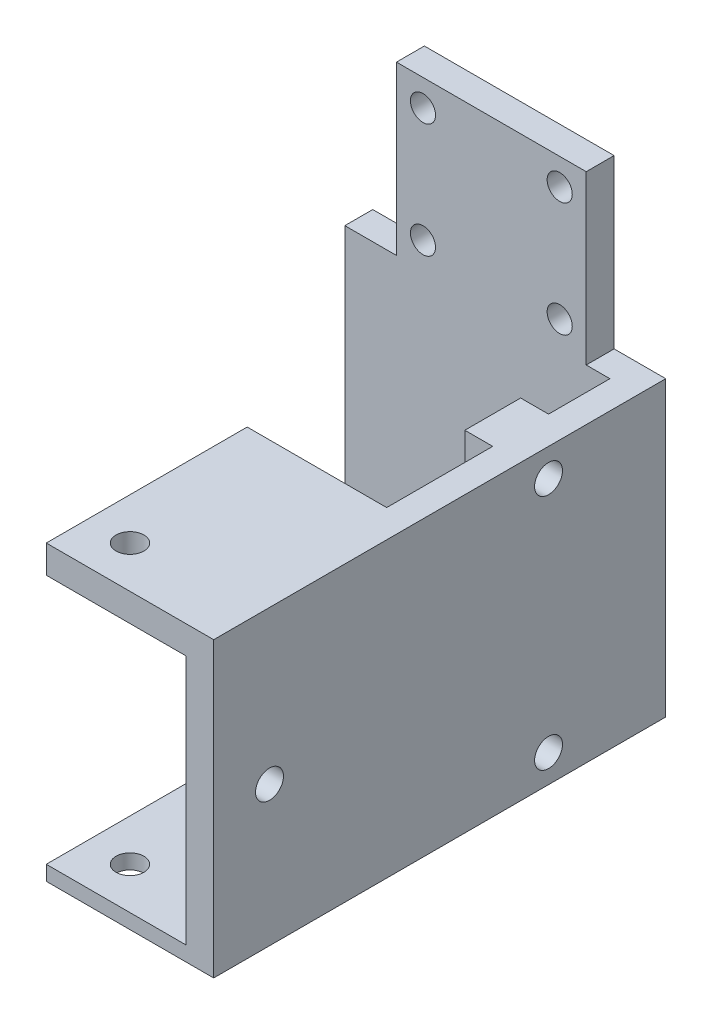
ISO-10303-21;
HEADER;
FILE_DESCRIPTION(('STEP AP214'),'2;1');
FILE_NAME('part.step','',(''),(''),'','','');
FILE_SCHEMA(('AUTOMOTIVE_DESIGN { 1 0 10303 214 1 1 1 1 }'));
ENDSEC;
DATA;
#1=APPLICATION_CONTEXT('core data for automotive mechanical design processes');
#2=APPLICATION_PROTOCOL_DEFINITION('international standard','automotive_design',2000,#1);
#3=PRODUCT_CONTEXT('',#1,'mechanical');
#4=PRODUCT('Part','Part','',(#3));
#5=PRODUCT_RELATED_PRODUCT_CATEGORY('part','',(#4));
#6=PRODUCT_DEFINITION_FORMATION('','',#4);
#7=PRODUCT_DEFINITION_CONTEXT('part definition',#1,'design');
#8=PRODUCT_DEFINITION('design','',#6,#7);
#9=PRODUCT_DEFINITION_SHAPE('','',#8);
#10=(LENGTH_UNIT() NAMED_UNIT(*) SI_UNIT(.MILLI.,.METRE.));
#11=(NAMED_UNIT(*) PLANE_ANGLE_UNIT() SI_UNIT($,.RADIAN.));
#12=(NAMED_UNIT(*) SI_UNIT($,.STERADIAN.) SOLID_ANGLE_UNIT());
#13=UNCERTAINTY_MEASURE_WITH_UNIT(LENGTH_MEASURE(1.E-05),#10,'distance_accuracy_value','');
#14=(GEOMETRIC_REPRESENTATION_CONTEXT(3) GLOBAL_UNCERTAINTY_ASSIGNED_CONTEXT((#13)) GLOBAL_UNIT_ASSIGNED_CONTEXT((#10,
#11,#12)) REPRESENTATION_CONTEXT('',''));
#15=CARTESIAN_POINT('',(0.,0.,0.));
#16=DIRECTION('',(0.,0.,1.));
#17=DIRECTION('',(1.,0.,0.));
#18=AXIS2_PLACEMENT_3D('',#15,#16,#17);
#19=CARTESIAN_POINT('',(38.25,77.5,45.));
#20=DIRECTION('',(-1.,0.,0.));
#21=DIRECTION('',(0.,-1.,0.));
#22=AXIS2_PLACEMENT_3D('',#19,#20,#21);
#23=PLANE('',#22);
#24=DIRECTION('',(0.,0.,-1.));
#25=VECTOR('',#24,1.);
#26=CARTESIAN_POINT('',(38.25,30.,45.));
#27=LINE('',#26,#25);
#28=CARTESIAN_POINT('',(38.25,30.,16.));
#29=VERTEX_POINT('',#28);
#30=CARTESIAN_POINT('',(38.25,30.,5.));
#31=VERTEX_POINT('',#30);
#32=EDGE_CURVE('E231',#29,#31,#27,.T.);
#33=ORIENTED_EDGE('',*,*,#32,.F.);
#34=DIRECTION('',(0.,-1.,0.));
#35=VECTOR('',#34,1.);
#36=CARTESIAN_POINT('',(38.25,82.5,16.));
#37=LINE('',#36,#35);
#38=CARTESIAN_POINT('',(38.25,82.5,16.));
#39=VERTEX_POINT('',#38);
#40=EDGE_CURVE('E215',#39,#29,#37,.T.);
#41=ORIENTED_EDGE('',*,*,#40,.F.);
#42=DIRECTION('',(0.,0.,1.));
#43=VECTOR('',#42,1.);
#44=CARTESIAN_POINT('',(38.25,82.5,45.));
#45=LINE('',#44,#43);
#46=CARTESIAN_POINT('',(38.25,82.5,5.));
#47=VERTEX_POINT('',#46);
#48=EDGE_CURVE('E245',#47,#39,#45,.T.);
#49=ORIENTED_EDGE('',*,*,#48,.F.);
#50=DIRECTION('',(0.,1.,0.));
#51=VECTOR('',#50,1.);
#52=CARTESIAN_POINT('',(38.25,77.5,5.));
#53=LINE('',#52,#51);
#54=EDGE_CURVE('E315',#31,#47,#53,.T.);
#55=ORIENTED_EDGE('',*,*,#54,.F.);
#56=EDGE_LOOP('',(#33,#41,#49,#55));
#57=FACE_BOUND('',#56,.T.);
#58=ADVANCED_FACE('F37',(#57),#23,.T.);
#59=CARTESIAN_POINT('',(38.25,55.075,71.));
#60=DIRECTION('',(-1.,0.,0.));
#61=DIRECTION('',(0.,-1.,0.));
#62=AXIS2_PLACEMENT_3D('',#59,#60,#61);
#63=CIRCLE('',#62,2.50000000000001);
#64=CARTESIAN_POINT('',(38.25,52.575,71.));
#65=VERTEX_POINT('',#64);
#66=EDGE_CURVE('E272',#65,#65,#63,.T.);
#67=ORIENTED_EDGE('',*,*,#66,.F.);
#68=EDGE_LOOP('',(#67));
#69=FACE_BOUND('',#68,.T.);
#70=CARTESIAN_POINT('',(38.25,82.5,26.));
#71=VERTEX_POINT('',#70);
#72=CARTESIAN_POINT('',(38.25,82.5,45.));
#73=VERTEX_POINT('',#72);
#74=EDGE_CURVE('E234',#71,#73,#45,.T.);
#75=ORIENTED_EDGE('',*,*,#74,.F.);
#76=DIRECTION('',(0.,1.,0.));
#77=VECTOR('',#76,1.);
#78=CARTESIAN_POINT('',(38.25,82.5,26.));
#79=LINE('',#78,#77);
#80=CARTESIAN_POINT('',(38.25,30.,26.));
#81=VERTEX_POINT('',#80);
#82=EDGE_CURVE('E211',#81,#71,#79,.T.);
#83=ORIENTED_EDGE('',*,*,#82,.F.);
#84=CARTESIAN_POINT('',(38.25,30.,45.));
#85=VERTEX_POINT('',#84);
#86=EDGE_CURVE('E228',#85,#81,#27,.T.);
#87=ORIENTED_EDGE('',*,*,#86,.F.);
#88=DIRECTION('',(0.,-1.,0.));
#89=VECTOR('',#88,1.);
#90=CARTESIAN_POINT('',(38.25,82.5,45.));
#91=LINE('',#90,#89);
#92=CARTESIAN_POINT('',(38.25,35.,45.));
#93=VERTEX_POINT('',#92);
#94=EDGE_CURVE('E230',#93,#85,#91,.T.);
#95=ORIENTED_EDGE('',*,*,#94,.F.);
#96=DIRECTION('',(0.,0.,-1.));
#97=VECTOR('',#96,1.);
#98=CARTESIAN_POINT('',(38.25,35.,45.));
#99=LINE('',#98,#97);
#100=CARTESIAN_POINT('',(38.25,35.,55.480590064434));
#101=VERTEX_POINT('',#100);
#102=EDGE_CURVE('E320',#101,#93,#99,.T.);
#103=ORIENTED_EDGE('',*,*,#102,.F.);
#104=DIRECTION('',(0.,1.,0.));
#105=VECTOR('',#104,1.);
#106=CARTESIAN_POINT('',(38.25,32.65,55.480590064434));
#107=LINE('',#106,#105);
#108=CARTESIAN_POINT('',(38.25,32.65,55.480590064434));
#109=VERTEX_POINT('',#108);
#110=EDGE_CURVE('E261',#109,#101,#107,.T.);
#111=ORIENTED_EDGE('',*,*,#110,.F.);
#112=DIRECTION('',(0.,0.,-1.));
#113=VECTOR('',#112,1.);
#114=CARTESIAN_POINT('',(38.25,32.65,81.));
#115=LINE('',#114,#113);
#116=CARTESIAN_POINT('',(38.25,32.65,81.));
#117=VERTEX_POINT('',#116);
#118=EDGE_CURVE('E256',#117,#109,#115,.T.);
#119=ORIENTED_EDGE('',*,*,#118,.F.);
#120=DIRECTION('',(0.,-1.,0.));
#121=VECTOR('',#120,1.);
#122=CARTESIAN_POINT('',(38.25,77.5,81.));
#123=LINE('',#122,#121);
#124=CARTESIAN_POINT('',(38.25,77.5,81.));
#125=VERTEX_POINT('',#124);
#126=EDGE_CURVE('E290',#125,#117,#123,.T.);
#127=ORIENTED_EDGE('',*,*,#126,.F.);
#128=DIRECTION('',(0.,0.,-1.));
#129=VECTOR('',#128,1.);
#130=CARTESIAN_POINT('',(38.25,77.5,45.));
#131=LINE('',#130,#129);
#132=CARTESIAN_POINT('',(38.25,77.5,45.));
#133=VERTEX_POINT('',#132);
#134=EDGE_CURVE('E317',#125,#133,#131,.T.);
#135=ORIENTED_EDGE('',*,*,#134,.T.);
#136=EDGE_CURVE('E232',#73,#133,#91,.T.);
#137=ORIENTED_EDGE('',*,*,#136,.F.);
#138=EDGE_LOOP('',(#75,#83,#87,#95,#103,#111,#119,#127,#135,#137));
#139=FACE_BOUND('',#138,.T.);
#140=ADVANCED_FACE('F397',(#69,#139),#23,.T.);
#141=CARTESIAN_POINT('',(0.,82.5,5.));
#142=DIRECTION('',(0.,-1.,0.));
#143=DIRECTION('',(0.,0.,-1.));
#144=AXIS2_PLACEMENT_3D('',#141,#142,#143);
#145=PLANE('',#144);
#146=DIRECTION('',(0.,0.,-1.));
#147=VECTOR('',#146,1.);
#148=CARTESIAN_POINT('',(-9.24999999999999,82.5,5.));
#149=LINE('',#148,#147);
#150=CARTESIAN_POINT('',(-9.24999999999999,82.5,5.));
#151=VERTEX_POINT('',#150);
#152=CARTESIAN_POINT('',(-9.24999999999999,82.5,0.));
#153=VERTEX_POINT('',#152);
#154=EDGE_CURVE('E374',#151,#153,#149,.T.);
#155=ORIENTED_EDGE('',*,*,#154,.F.);
#156=DIRECTION('',(-1.,0.,0.));
#157=VECTOR('',#156,1.);
#158=CARTESIAN_POINT('',(104.25189391222,82.5,5.));
#159=LINE('',#158,#157);
#160=CARTESIAN_POINT('',(0.,82.5,5.));
#161=VERTEX_POINT('',#160);
#162=EDGE_CURVE('E242',#161,#151,#159,.T.);
#163=ORIENTED_EDGE('',*,*,#162,.F.);
#164=DIRECTION('',(0.,0.,-1.));
#165=VECTOR('',#164,1.);
#166=CARTESIAN_POINT('',(0.,82.5,5.));
#167=LINE('',#166,#165);
#168=CARTESIAN_POINT('',(0.,82.5,0.));
#169=VERTEX_POINT('',#168);
#170=EDGE_CURVE('E376',#161,#169,#167,.T.);
#171=ORIENTED_EDGE('',*,*,#170,.T.);
#172=DIRECTION('',(-1.,0.,0.));
#173=VECTOR('',#172,1.);
#174=CARTESIAN_POINT('',(0.,82.5,0.));
#175=LINE('',#174,#173);
#176=EDGE_CURVE('E366',#169,#153,#175,.T.);
#177=ORIENTED_EDGE('',*,*,#176,.T.);
#178=EDGE_LOOP('',(#155,#163,#171,#177));
#179=FACE_BOUND('',#178,.T.);
#180=ADVANCED_FACE('F400',(#179),#145,.F.);
#181=CARTESIAN_POINT('',(0.,0.,0.));
#182=DIRECTION('',(0.,0.,1.));
#183=DIRECTION('',(1.,0.,0.));
#184=AXIS2_PLACEMENT_3D('',#181,#182,#183);
#185=PLANE('',#184);
#186=DIRECTION('',(0.,1.,0.));
#187=VECTOR('',#186,1.);
#188=CARTESIAN_POINT('',(43.25,82.5,0.));
#189=LINE('',#188,#187);
#190=CARTESIAN_POINT('',(43.25,30.,0.));
#191=VERTEX_POINT('',#190);
#192=CARTESIAN_POINT('',(43.25,82.5,0.));
#193=VERTEX_POINT('',#192);
#194=EDGE_CURVE('E345',#191,#193,#189,.T.);
#195=ORIENTED_EDGE('',*,*,#194,.F.);
#196=DIRECTION('',(1.,0.,0.));
#197=VECTOR('',#196,1.);
#198=CARTESIAN_POINT('',(0.,30.,0.));
#199=LINE('',#198,#197);
#200=CARTESIAN_POINT('',(-9.24999999999999,30.,0.));
#201=VERTEX_POINT('',#200);
#202=EDGE_CURVE('E351',#201,#191,#199,.T.);
#203=ORIENTED_EDGE('',*,*,#202,.F.);
#204=DIRECTION('',(0.,-1.,0.));
#205=VECTOR('',#204,1.);
#206=CARTESIAN_POINT('',(-9.24999999999999,30.,0.));
#207=LINE('',#206,#205);
#208=EDGE_CURVE('E369',#153,#201,#207,.T.);
#209=ORIENTED_EDGE('',*,*,#208,.F.);
#210=ORIENTED_EDGE('',*,*,#176,.F.);
#211=DIRECTION('',(0.,-1.,0.));
#212=VECTOR('',#211,1.);
#213=CARTESIAN_POINT('',(0.,82.5,0.));
#214=LINE('',#213,#212);
#215=CARTESIAN_POINT('',(0.,112.5,0.));
#216=VERTEX_POINT('',#215);
#217=EDGE_CURVE('E364',#216,#169,#214,.T.);
#218=ORIENTED_EDGE('',*,*,#217,.F.);
#219=DIRECTION('',(-1.,0.,0.));
#220=VECTOR('',#219,1.);
#221=CARTESIAN_POINT('',(34.,112.5,0.));
#222=LINE('',#221,#220);
#223=CARTESIAN_POINT('',(34.,112.5,0.));
#224=VERTEX_POINT('',#223);
#225=EDGE_CURVE('E362',#224,#216,#222,.T.);
#226=ORIENTED_EDGE('',*,*,#225,.F.);
#227=DIRECTION('',(0.,1.,0.));
#228=VECTOR('',#227,1.);
#229=CARTESIAN_POINT('',(34.,82.5,0.));
#230=LINE('',#229,#228);
#231=CARTESIAN_POINT('',(34.,82.5,0.));
#232=VERTEX_POINT('',#231);
#233=EDGE_CURVE('E360',#232,#224,#230,.T.);
#234=ORIENTED_EDGE('',*,*,#233,.F.);
#235=DIRECTION('',(-1.,0.,0.));
#236=VECTOR('',#235,1.);
#237=CARTESIAN_POINT('',(43.25,82.5,0.));
#238=LINE('',#237,#236);
#239=EDGE_CURVE('E358',#193,#232,#238,.T.);
#240=ORIENTED_EDGE('',*,*,#239,.F.);
#241=EDGE_LOOP('',(#195,#203,#209,#210,#218,#226,#234,#240));
#242=FACE_BOUND('',#241,.T.);
#243=CARTESIAN_POINT('',(4.74999999999999,107.75,0.));
#244=DIRECTION('',(0.,0.,1.));
#245=DIRECTION('',(1.,0.,0.));
#246=AXIS2_PLACEMENT_3D('',#243,#244,#245);
#247=CIRCLE('',#246,2.25);
#248=CARTESIAN_POINT('',(7.,107.75,0.));
#249=VERTEX_POINT('',#248);
#250=EDGE_CURVE('E339',#249,#249,#247,.T.);
#251=ORIENTED_EDGE('',*,*,#250,.T.);
#252=EDGE_LOOP('',(#251));
#253=FACE_BOUND('',#252,.T.);
#254=CARTESIAN_POINT('',(29.25,107.75,0.));
#255=DIRECTION('',(0.,0.,1.));
#256=DIRECTION('',(1.,0.,0.));
#257=AXIS2_PLACEMENT_3D('',#254,#255,#256);
#258=CIRCLE('',#257,2.25);
#259=CARTESIAN_POINT('',(31.5,107.75,0.));
#260=VERTEX_POINT('',#259);
#261=EDGE_CURVE('E333',#260,#260,#258,.T.);
#262=ORIENTED_EDGE('',*,*,#261,.T.);
#263=EDGE_LOOP('',(#262));
#264=FACE_BOUND('',#263,.T.);
#265=CARTESIAN_POINT('',(29.25,87.25,0.));
#266=DIRECTION('',(0.,0.,1.));
#267=DIRECTION('',(1.,0.,0.));
#268=AXIS2_PLACEMENT_3D('',#265,#266,#267);
#269=CIRCLE('',#268,2.25);
#270=CARTESIAN_POINT('',(31.5,87.25,0.));
#271=VERTEX_POINT('',#270);
#272=EDGE_CURVE('E327',#271,#271,#269,.T.);
#273=ORIENTED_EDGE('',*,*,#272,.T.);
#274=EDGE_LOOP('',(#273));
#275=FACE_BOUND('',#274,.T.);
#276=CARTESIAN_POINT('',(4.74999999999999,87.25,0.));
#277=DIRECTION('',(0.,0.,1.));
#278=DIRECTION('',(1.,0.,0.));
#279=AXIS2_PLACEMENT_3D('',#276,#277,#278);
#280=CIRCLE('',#279,2.25);
#281=CARTESIAN_POINT('',(6.99999999999999,87.25,0.));
#282=VERTEX_POINT('',#281);
#283=EDGE_CURVE('E323',#282,#282,#280,.T.);
#284=ORIENTED_EDGE('',*,*,#283,.T.);
#285=EDGE_LOOP('',(#284));
#286=FACE_BOUND('',#285,.T.);
#287=ADVANCED_FACE('F424',(#242,#253,#264,#275,#286),#185,.F.);
#288=CARTESIAN_POINT('',(43.25,82.5,5.));
#289=DIRECTION('',(-1.,0.,0.));
#290=DIRECTION('',(0.,-1.,0.));
#291=AXIS2_PLACEMENT_3D('',#288,#289,#290);
#292=PLANE('',#291);
#293=CARTESIAN_POINT('',(43.25,77.5,21.));
#294=DIRECTION('',(-1.,0.,0.));
#295=DIRECTION('',(0.,-1.,0.));
#296=AXIS2_PLACEMENT_3D('',#293,#294,#295);
#297=CIRCLE('',#296,2.5);
#298=CARTESIAN_POINT('',(43.25,75.,21.));
#299=VERTEX_POINT('',#298);
#300=EDGE_CURVE('E220',#299,#299,#297,.T.);
#301=ORIENTED_EDGE('',*,*,#300,.T.);
#302=EDGE_LOOP('',(#301));
#303=FACE_BOUND('',#302,.T.);
#304=CARTESIAN_POINT('',(43.25,35.,21.));
#305=DIRECTION('',(-1.,0.,0.));
#306=DIRECTION('',(0.,-1.,0.));
#307=AXIS2_PLACEMENT_3D('',#304,#305,#306);
#308=CIRCLE('',#307,2.5);
#309=CARTESIAN_POINT('',(43.25,32.5,21.));
#310=VERTEX_POINT('',#309);
#311=EDGE_CURVE('E217',#310,#310,#308,.T.);
#312=ORIENTED_EDGE('',*,*,#311,.T.);
#313=EDGE_LOOP('',(#312));
#314=FACE_BOUND('',#313,.T.);
#315=CARTESIAN_POINT('',(43.25,55.075,71.));
#316=DIRECTION('',(1.,0.,0.));
#317=DIRECTION('',(0.,1.,0.));
#318=AXIS2_PLACEMENT_3D('',#315,#316,#317);
#319=CIRCLE('',#318,2.50000000000001);
#320=CARTESIAN_POINT('',(43.25,57.575,71.));
#321=VERTEX_POINT('',#320);
#322=EDGE_CURVE('E269',#321,#321,#319,.T.);
#323=ORIENTED_EDGE('',*,*,#322,.F.);
#324=EDGE_LOOP('',(#323));
#325=FACE_BOUND('',#324,.T.);
#326=ORIENTED_EDGE('',*,*,#194,.T.);
#327=DIRECTION('',(0.,0.,-1.));
#328=VECTOR('',#327,1.);
#329=CARTESIAN_POINT('',(43.25,82.5,5.));
#330=LINE('',#329,#328);
#331=CARTESIAN_POINT('',(43.25,82.5,81.));
#332=VERTEX_POINT('',#331);
#333=EDGE_CURVE('E46',#332,#193,#330,.T.);
#334=ORIENTED_EDGE('',*,*,#333,.F.);
#335=DIRECTION('',(0.,1.,0.));
#336=VECTOR('',#335,1.);
#337=CARTESIAN_POINT('',(43.25,82.5,81.));
#338=LINE('',#337,#336);
#339=CARTESIAN_POINT('',(43.25,30.,81.));
#340=VERTEX_POINT('',#339);
#341=EDGE_CURVE('E297',#340,#332,#338,.T.);
#342=ORIENTED_EDGE('',*,*,#341,.F.);
#343=DIRECTION('',(0.,0.,-1.));
#344=VECTOR('',#343,1.);
#345=CARTESIAN_POINT('',(43.25,30.,5.));
#346=LINE('',#345,#344);
#347=EDGE_CURVE('E11',#340,#191,#346,.T.);
#348=ORIENTED_EDGE('',*,*,#347,.T.);
#349=EDGE_LOOP('',(#326,#334,#342,#348));
#350=FACE_BOUND('',#349,.T.);
#351=ADVANCED_FACE('F39',(#303,#314,#325,#350),#292,.F.);
#352=CARTESIAN_POINT('',(34.,82.5,5.));
#353=DIRECTION('',(-1.,0.,0.));
#354=DIRECTION('',(0.,0.,1.));
#355=AXIS2_PLACEMENT_3D('',#352,#353,#354);
#356=PLANE('',#355);
#357=ORIENTED_EDGE('',*,*,#233,.T.);
#358=DIRECTION('',(0.,0.,-1.));
#359=VECTOR('',#358,1.);
#360=CARTESIAN_POINT('',(34.,112.5,5.));
#361=LINE('',#360,#359);
#362=CARTESIAN_POINT('',(34.,112.5,5.));
#363=VERTEX_POINT('',#362);
#364=EDGE_CURVE('E382',#363,#224,#361,.T.);
#365=ORIENTED_EDGE('',*,*,#364,.F.);
#366=DIRECTION('',(0.,1.,0.));
#367=VECTOR('',#366,1.);
#368=CARTESIAN_POINT('',(34.,82.5,5.));
#369=LINE('',#368,#367);
#370=CARTESIAN_POINT('',(34.,82.5,5.));
#371=VERTEX_POINT('',#370);
#372=EDGE_CURVE('E348',#371,#363,#369,.T.);
#373=ORIENTED_EDGE('',*,*,#372,.F.);
#374=DIRECTION('',(0.,0.,-1.));
#375=VECTOR('',#374,1.);
#376=CARTESIAN_POINT('',(34.,82.5,5.));
#377=LINE('',#376,#375);
#378=EDGE_CURVE('E385',#371,#232,#377,.T.);
#379=ORIENTED_EDGE('',*,*,#378,.T.);
#380=EDGE_LOOP('',(#357,#365,#373,#379));
#381=FACE_BOUND('',#380,.T.);
#382=ADVANCED_FACE('F431',(#381),#356,.F.);
#383=CARTESIAN_POINT('',(34.,112.5,5.));
#384=DIRECTION('',(0.,-1.,0.));
#385=DIRECTION('',(0.,0.,-1.));
#386=AXIS2_PLACEMENT_3D('',#383,#384,#385);
#387=PLANE('',#386);
#388=ORIENTED_EDGE('',*,*,#225,.T.);
#389=DIRECTION('',(0.,0.,-1.));
#390=VECTOR('',#389,1.);
#391=CARTESIAN_POINT('',(0.,112.5,5.));
#392=LINE('',#391,#390);
#393=CARTESIAN_POINT('',(0.,112.5,5.));
#394=VERTEX_POINT('',#393);
#395=EDGE_CURVE('E379',#394,#216,#392,.T.);
#396=ORIENTED_EDGE('',*,*,#395,.F.);
#397=DIRECTION('',(-1.,0.,0.));
#398=VECTOR('',#397,1.);
#399=CARTESIAN_POINT('',(34.,112.5,5.));
#400=LINE('',#399,#398);
#401=EDGE_CURVE('E350',#363,#394,#400,.T.);
#402=ORIENTED_EDGE('',*,*,#401,.F.);
#403=ORIENTED_EDGE('',*,*,#364,.T.);
#404=EDGE_LOOP('',(#388,#396,#402,#403));
#405=FACE_BOUND('',#404,.T.);
#406=ADVANCED_FACE('F435',(#405),#387,.F.);
#407=CARTESIAN_POINT('',(0.,82.5,5.));
#408=DIRECTION('',(1.,0.,0.));
#409=DIRECTION('',(0.,0.,-1.));
#410=AXIS2_PLACEMENT_3D('',#407,#408,#409);
#411=PLANE('',#410);
#412=ORIENTED_EDGE('',*,*,#217,.T.);
#413=ORIENTED_EDGE('',*,*,#170,.F.);
#414=DIRECTION('',(0.,-1.,0.));
#415=VECTOR('',#414,1.);
#416=CARTESIAN_POINT('',(0.,82.5,5.));
#417=LINE('',#416,#415);
#418=EDGE_CURVE('E353',#394,#161,#417,.T.);
#419=ORIENTED_EDGE('',*,*,#418,.F.);
#420=ORIENTED_EDGE('',*,*,#395,.T.);
#421=EDGE_LOOP('',(#412,#413,#419,#420));
#422=FACE_BOUND('',#421,.T.);
#423=ADVANCED_FACE('F516',(#422),#411,.F.);
#424=CARTESIAN_POINT('',(20.75,82.5,73.5));
#425=DIRECTION('',(0.,-1.,0.));
#426=DIRECTION('',(0.,0.,-1.));
#427=AXIS2_PLACEMENT_3D('',#424,#425,#426);
#428=CIRCLE('',#427,2.5);
#429=CARTESIAN_POINT('',(20.75,82.5,71.));
#430=VERTEX_POINT('',#429);
#431=EDGE_CURVE('E276',#430,#430,#428,.T.);
#432=ORIENTED_EDGE('',*,*,#431,.T.);
#433=EDGE_LOOP('',(#432));
#434=FACE_BOUND('',#433,.T.);
#435=ORIENTED_EDGE('',*,*,#48,.T.);
#436=DIRECTION('',(1.,0.,0.));
#437=VECTOR('',#436,1.);
#438=CARTESIAN_POINT('',(33.25,82.5,16.));
#439=LINE('',#438,#437);
#440=CARTESIAN_POINT('',(33.25,82.5,16.));
#441=VERTEX_POINT('',#440);
#442=EDGE_CURVE('E447',#441,#39,#439,.T.);
#443=ORIENTED_EDGE('',*,*,#442,.F.);
#444=DIRECTION('',(0.,0.,-1.));
#445=VECTOR('',#444,1.);
#446=CARTESIAN_POINT('',(33.25,82.5,16.));
#447=LINE('',#446,#445);
#448=CARTESIAN_POINT('',(33.25,82.5,26.));
#449=VERTEX_POINT('',#448);
#450=EDGE_CURVE('E208',#449,#441,#447,.T.);
#451=ORIENTED_EDGE('',*,*,#450,.F.);
#452=DIRECTION('',(1.,0.,0.));
#453=VECTOR('',#452,1.);
#454=CARTESIAN_POINT('',(33.25,82.5,26.));
#455=LINE('',#454,#453);
#456=EDGE_CURVE('E54',#449,#71,#455,.T.);
#457=ORIENTED_EDGE('',*,*,#456,.T.);
#458=ORIENTED_EDGE('',*,*,#74,.T.);
#459=DIRECTION('',(-1.,0.,0.));
#460=VECTOR('',#459,1.);
#461=CARTESIAN_POINT('',(104.25189391222,82.5,45.));
#462=LINE('',#461,#460);
#463=CARTESIAN_POINT('',(13.25,82.5,45.));
#464=VERTEX_POINT('',#463);
#465=EDGE_CURVE('E227',#73,#464,#462,.T.);
#466=ORIENTED_EDGE('',*,*,#465,.T.);
#467=DIRECTION('',(0.,0.,-1.));
#468=VECTOR('',#467,1.);
#469=CARTESIAN_POINT('',(13.25,82.5,81.));
#470=LINE('',#469,#468);
#471=CARTESIAN_POINT('',(13.25,82.5,81.));
#472=VERTEX_POINT('',#471);
#473=EDGE_CURVE('E312',#472,#464,#470,.T.);
#474=ORIENTED_EDGE('',*,*,#473,.F.);
#475=DIRECTION('',(-1.,0.,0.));
#476=VECTOR('',#475,1.);
#477=CARTESIAN_POINT('',(13.25,82.5,81.));
#478=LINE('',#477,#476);
#479=EDGE_CURVE('E281',#332,#472,#478,.T.);
#480=ORIENTED_EDGE('',*,*,#479,.F.);
#481=ORIENTED_EDGE('',*,*,#333,.T.);
#482=ORIENTED_EDGE('',*,*,#239,.T.);
#483=ORIENTED_EDGE('',*,*,#378,.F.);
#484=EDGE_CURVE('E240',#47,#371,#159,.T.);
#485=ORIENTED_EDGE('',*,*,#484,.F.);
#486=EDGE_LOOP('',(#435,#443,#451,#457,#458,#466,#474,#480,#481,#482,#483,#485));
#487=FACE_BOUND('',#486,.T.);
#488=ADVANCED_FACE('F407',(#434,#487),#145,.F.);
#489=CARTESIAN_POINT('',(-9.24999999999999,30.,5.));
#490=DIRECTION('',(1.,0.,0.));
#491=DIRECTION('',(0.,1.,0.));
#492=AXIS2_PLACEMENT_3D('',#489,#490,#491);
#493=PLANE('',#492);
#494=DIRECTION('',(0.,0.,-1.));
#495=VECTOR('',#494,1.);
#496=CARTESIAN_POINT('',(-9.24999999999999,30.,5.));
#497=LINE('',#496,#495);
#498=CARTESIAN_POINT('',(-9.24999999999999,30.,5.));
#499=VERTEX_POINT('',#498);
#500=EDGE_CURVE('E356',#499,#201,#497,.T.);
#501=ORIENTED_EDGE('',*,*,#500,.F.);
#502=DIRECTION('',(0.,-1.,0.));
#503=VECTOR('',#502,1.);
#504=CARTESIAN_POINT('',(-9.24999999999999,74.5,5.));
#505=LINE('',#504,#503);
#506=EDGE_CURVE('E267',#151,#499,#505,.T.);
#507=ORIENTED_EDGE('',*,*,#506,.F.);
#508=ORIENTED_EDGE('',*,*,#154,.T.);
#509=ORIENTED_EDGE('',*,*,#208,.T.);
#510=EDGE_LOOP('',(#501,#507,#508,#509));
#511=FACE_BOUND('',#510,.T.);
#512=ADVANCED_FACE('F510',(#511),#493,.F.);
#513=CARTESIAN_POINT('',(0.,30.,5.));
#514=DIRECTION('',(0.,1.,0.));
#515=DIRECTION('',(0.,0.,1.));
#516=AXIS2_PLACEMENT_3D('',#513,#514,#515);
#517=PLANE('',#516);
#518=DIRECTION('',(0.,0.,-1.));
#519=VECTOR('',#518,1.);
#520=CARTESIAN_POINT('',(13.25,30.,81.));
#521=LINE('',#520,#519);
#522=CARTESIAN_POINT('',(13.25,30.,81.));
#523=VERTEX_POINT('',#522);
#524=CARTESIAN_POINT('',(13.25,30.,45.));
#525=VERTEX_POINT('',#524);
#526=EDGE_CURVE('E300',#523,#525,#521,.T.);
#527=ORIENTED_EDGE('',*,*,#526,.T.);
#528=DIRECTION('',(-1.,0.,0.));
#529=VECTOR('',#528,1.);
#530=CARTESIAN_POINT('',(104.25189391222,30.,45.));
#531=LINE('',#530,#529);
#532=EDGE_CURVE('E235',#85,#525,#531,.T.);
#533=ORIENTED_EDGE('',*,*,#532,.F.);
#534=ORIENTED_EDGE('',*,*,#86,.T.);
#535=DIRECTION('',(1.,0.,0.));
#536=VECTOR('',#535,1.);
#537=CARTESIAN_POINT('',(33.25,30.,26.));
#538=LINE('',#537,#536);
#539=CARTESIAN_POINT('',(33.25,30.,26.));
#540=VERTEX_POINT('',#539);
#541=EDGE_CURVE('E199',#540,#81,#538,.T.);
#542=ORIENTED_EDGE('',*,*,#541,.F.);
#543=DIRECTION('',(0.,0.,1.));
#544=VECTOR('',#543,1.);
#545=CARTESIAN_POINT('',(33.25,30.,16.));
#546=LINE('',#545,#544);
#547=CARTESIAN_POINT('',(33.25,30.,16.));
#548=VERTEX_POINT('',#547);
#549=EDGE_CURVE('E190',#548,#540,#546,.T.);
#550=ORIENTED_EDGE('',*,*,#549,.F.);
#551=DIRECTION('',(1.,0.,0.));
#552=VECTOR('',#551,1.);
#553=CARTESIAN_POINT('',(33.25,30.,16.));
#554=LINE('',#553,#552);
#555=EDGE_CURVE('E196',#548,#29,#554,.T.);
#556=ORIENTED_EDGE('',*,*,#555,.T.);
#557=ORIENTED_EDGE('',*,*,#32,.T.);
#558=DIRECTION('',(-1.,0.,0.));
#559=VECTOR('',#558,1.);
#560=CARTESIAN_POINT('',(104.25189391222,30.,5.));
#561=LINE('',#560,#559);
#562=EDGE_CURVE('E237',#31,#499,#561,.T.);
#563=ORIENTED_EDGE('',*,*,#562,.T.);
#564=ORIENTED_EDGE('',*,*,#500,.T.);
#565=ORIENTED_EDGE('',*,*,#202,.T.);
#566=ORIENTED_EDGE('',*,*,#347,.F.);
#567=DIRECTION('',(1.,0.,0.));
#568=VECTOR('',#567,1.);
#569=CARTESIAN_POINT('',(43.25,30.,81.));
#570=LINE('',#569,#568);
#571=EDGE_CURVE('E294',#523,#340,#570,.T.);
#572=ORIENTED_EDGE('',*,*,#571,.F.);
#573=EDGE_LOOP('',(#527,#533,#534,#542,#550,#556,#557,#563,#564,#565,#566,#572));
#574=FACE_BOUND('',#573,.T.);
#575=CARTESIAN_POINT('',(20.75,30.,73.5));
#576=DIRECTION('',(0.,1.,0.));
#577=DIRECTION('',(0.,0.,1.));
#578=AXIS2_PLACEMENT_3D('',#575,#576,#577);
#579=CIRCLE('',#578,2.5);
#580=CARTESIAN_POINT('',(20.75,30.,76.));
#581=VERTEX_POINT('',#580);
#582=EDGE_CURVE('E273',#581,#581,#579,.T.);
#583=ORIENTED_EDGE('',*,*,#582,.T.);
#584=EDGE_LOOP('',(#583));
#585=FACE_BOUND('',#584,.T.);
#586=ADVANCED_FACE('F193',(#574,#585),#517,.F.);
#587=CARTESIAN_POINT('',(4.74999999999999,107.75,5.));
#588=DIRECTION('',(0.,0.,-1.));
#589=DIRECTION('',(-1.,0.,0.));
#590=AXIS2_PLACEMENT_3D('',#587,#588,#589);
#591=CYLINDRICAL_SURFACE('',#590,2.25);
#592=CARTESIAN_POINT('',(4.74999999999999,107.75,5.));
#593=DIRECTION('',(0.,0.,1.));
#594=DIRECTION('',(1.,0.,0.));
#595=AXIS2_PLACEMENT_3D('',#592,#593,#594);
#596=CIRCLE('',#595,2.25);
#597=CARTESIAN_POINT('',(7.,107.75,5.));
#598=VERTEX_POINT('',#597);
#599=EDGE_CURVE('E342',#598,#598,#596,.T.);
#600=ORIENTED_EDGE('',*,*,#599,.T.);
#601=EDGE_LOOP('',(#600));
#602=FACE_BOUND('',#601,.T.);
#603=ORIENTED_EDGE('',*,*,#250,.F.);
#604=EDGE_LOOP('',(#603));
#605=FACE_BOUND('',#604,.T.);
#606=ADVANCED_FACE('F499',(#602,#605),#591,.F.);
#607=CARTESIAN_POINT('',(29.25,107.75,5.));
#608=DIRECTION('',(0.,0.,-1.));
#609=DIRECTION('',(-1.,0.,0.));
#610=AXIS2_PLACEMENT_3D('',#607,#608,#609);
#611=CYLINDRICAL_SURFACE('',#610,2.25);
#612=CARTESIAN_POINT('',(29.25,107.75,5.));
#613=DIRECTION('',(0.,0.,1.));
#614=DIRECTION('',(1.,0.,0.));
#615=AXIS2_PLACEMENT_3D('',#612,#613,#614);
#616=CIRCLE('',#615,2.25);
#617=CARTESIAN_POINT('',(31.5,107.75,5.));
#618=VERTEX_POINT('',#617);
#619=EDGE_CURVE('E336',#618,#618,#616,.T.);
#620=ORIENTED_EDGE('',*,*,#619,.T.);
#621=EDGE_LOOP('',(#620));
#622=FACE_BOUND('',#621,.T.);
#623=ORIENTED_EDGE('',*,*,#261,.F.);
#624=EDGE_LOOP('',(#623));
#625=FACE_BOUND('',#624,.T.);
#626=ADVANCED_FACE('F495',(#622,#625),#611,.F.);
#627=CARTESIAN_POINT('',(29.25,87.25,5.));
#628=DIRECTION('',(0.,0.,-1.));
#629=DIRECTION('',(-1.,0.,0.));
#630=AXIS2_PLACEMENT_3D('',#627,#628,#629);
#631=CYLINDRICAL_SURFACE('',#630,2.25);
#632=CARTESIAN_POINT('',(29.25,87.25,5.));
#633=DIRECTION('',(0.,0.,1.));
#634=DIRECTION('',(1.,0.,0.));
#635=AXIS2_PLACEMENT_3D('',#632,#633,#634);
#636=CIRCLE('',#635,2.25);
#637=CARTESIAN_POINT('',(31.5,87.25,5.));
#638=VERTEX_POINT('',#637);
#639=EDGE_CURVE('E330',#638,#638,#636,.T.);
#640=ORIENTED_EDGE('',*,*,#639,.T.);
#641=EDGE_LOOP('',(#640));
#642=FACE_BOUND('',#641,.T.);
#643=ORIENTED_EDGE('',*,*,#272,.F.);
#644=EDGE_LOOP('',(#643));
#645=FACE_BOUND('',#644,.T.);
#646=ADVANCED_FACE('F491',(#642,#645),#631,.F.);
#647=CARTESIAN_POINT('',(4.74999999999999,87.25,5.));
#648=DIRECTION('',(0.,0.,-1.));
#649=DIRECTION('',(-1.,0.,0.));
#650=AXIS2_PLACEMENT_3D('',#647,#648,#649);
#651=CYLINDRICAL_SURFACE('',#650,2.25);
#652=CARTESIAN_POINT('',(4.74999999999999,87.25,5.));
#653=DIRECTION('',(0.,0.,1.));
#654=DIRECTION('',(1.,0.,0.));
#655=AXIS2_PLACEMENT_3D('',#652,#653,#654);
#656=CIRCLE('',#655,2.25);
#657=CARTESIAN_POINT('',(6.99999999999999,87.25,5.));
#658=VERTEX_POINT('',#657);
#659=EDGE_CURVE('E324',#658,#658,#656,.T.);
#660=ORIENTED_EDGE('',*,*,#659,.T.);
#661=EDGE_LOOP('',(#660));
#662=FACE_BOUND('',#661,.T.);
#663=ORIENTED_EDGE('',*,*,#283,.F.);
#664=EDGE_LOOP('',(#663));
#665=FACE_BOUND('',#664,.T.);
#666=ADVANCED_FACE('F487',(#662,#665),#651,.F.);
#667=CARTESIAN_POINT('',(-4.24999999999998,35.,45.));
#668=DIRECTION('',(0.,1.,0.));
#669=DIRECTION('',(0.,0.,1.));
#670=AXIS2_PLACEMENT_3D('',#667,#668,#669);
#671=PLANE('',#670);
#672=DIRECTION('',(1.,0.,0.));
#673=VECTOR('',#672,1.);
#674=CARTESIAN_POINT('',(-4.24999999999998,35.,45.));
#675=LINE('',#674,#673);
#676=CARTESIAN_POINT('',(13.25,35.,45.));
#677=VERTEX_POINT('',#676);
#678=EDGE_CURVE('E250',#677,#93,#675,.T.);
#679=ORIENTED_EDGE('',*,*,#678,.F.);
#680=DIRECTION('',(0.,0.,-1.));
#681=VECTOR('',#680,1.);
#682=CARTESIAN_POINT('',(13.25,35.,81.));
#683=LINE('',#682,#681);
#684=CARTESIAN_POINT('',(13.25,35.,55.480590064434));
#685=VERTEX_POINT('',#684);
#686=EDGE_CURVE('E306',#685,#677,#683,.T.);
#687=ORIENTED_EDGE('',*,*,#686,.F.);
#688=DIRECTION('',(-1.,0.,0.));
#689=VECTOR('',#688,1.);
#690=CARTESIAN_POINT('',(13.25,35.,55.480590064434));
#691=LINE('',#690,#689);
#692=EDGE_CURVE('E252',#101,#685,#691,.T.);
#693=ORIENTED_EDGE('',*,*,#692,.F.);
#694=ORIENTED_EDGE('',*,*,#102,.T.);
#695=EDGE_LOOP('',(#679,#687,#693,#694));
#696=FACE_BOUND('',#695,.T.);
#697=ADVANCED_FACE('F484',(#696),#671,.T.);
#698=CARTESIAN_POINT('',(-4.24999999999999,77.5,45.));
#699=DIRECTION('',(0.,-1.,0.));
#700=DIRECTION('',(0.,0.,-1.));
#701=AXIS2_PLACEMENT_3D('',#698,#699,#700);
#702=PLANE('',#701);
#703=DIRECTION('',(-1.,0.,0.));
#704=VECTOR('',#703,1.);
#705=CARTESIAN_POINT('',(-4.24999999999999,77.5,45.));
#706=LINE('',#705,#704);
#707=CARTESIAN_POINT('',(13.25,77.5,45.));
#708=VERTEX_POINT('',#707);
#709=EDGE_CURVE('E248',#133,#708,#706,.T.);
#710=ORIENTED_EDGE('',*,*,#709,.F.);
#711=ORIENTED_EDGE('',*,*,#134,.F.);
#712=DIRECTION('',(1.,0.,0.));
#713=VECTOR('',#712,1.);
#714=CARTESIAN_POINT('',(13.25,77.5,81.));
#715=LINE('',#714,#713);
#716=CARTESIAN_POINT('',(13.25,77.5,81.));
#717=VERTEX_POINT('',#716);
#718=EDGE_CURVE('E287',#717,#125,#715,.T.);
#719=ORIENTED_EDGE('',*,*,#718,.F.);
#720=DIRECTION('',(0.,0.,-1.));
#721=VECTOR('',#720,1.);
#722=CARTESIAN_POINT('',(13.25,77.5,81.));
#723=LINE('',#722,#721);
#724=EDGE_CURVE('E309',#717,#708,#723,.T.);
#725=ORIENTED_EDGE('',*,*,#724,.T.);
#726=EDGE_LOOP('',(#710,#711,#719,#725));
#727=FACE_BOUND('',#726,.T.);
#728=CARTESIAN_POINT('',(20.75,77.5,73.5));
#729=DIRECTION('',(0.,-1.,0.));
#730=DIRECTION('',(0.,0.,-1.));
#731=AXIS2_PLACEMENT_3D('',#728,#729,#730);
#732=CIRCLE('',#731,2.5);
#733=CARTESIAN_POINT('',(20.75,77.5,71.));
#734=VERTEX_POINT('',#733);
#735=EDGE_CURVE('E277',#734,#734,#732,.T.);
#736=ORIENTED_EDGE('',*,*,#735,.F.);
#737=EDGE_LOOP('',(#736));
#738=FACE_BOUND('',#737,.T.);
#739=ADVANCED_FACE('F482',(#727,#738),#702,.T.);
#740=CARTESIAN_POINT('',(0.,0.,5.));
#741=DIRECTION('',(0.,0.,1.));
#742=DIRECTION('',(1.,0.,0.));
#743=AXIS2_PLACEMENT_3D('',#740,#741,#742);
#744=PLANE('',#743);
#745=ORIENTED_EDGE('',*,*,#562,.F.);
#746=ORIENTED_EDGE('',*,*,#54,.T.);
#747=ORIENTED_EDGE('',*,*,#484,.T.);
#748=ORIENTED_EDGE('',*,*,#372,.T.);
#749=ORIENTED_EDGE('',*,*,#401,.T.);
#750=ORIENTED_EDGE('',*,*,#418,.T.);
#751=ORIENTED_EDGE('',*,*,#162,.T.);
#752=ORIENTED_EDGE('',*,*,#506,.T.);
#753=EDGE_LOOP('',(#745,#746,#747,#748,#749,#750,#751,#752));
#754=FACE_BOUND('',#753,.T.);
#755=ORIENTED_EDGE('',*,*,#659,.F.);
#756=EDGE_LOOP('',(#755));
#757=FACE_BOUND('',#756,.T.);
#758=ORIENTED_EDGE('',*,*,#619,.F.);
#759=EDGE_LOOP('',(#758));
#760=FACE_BOUND('',#759,.T.);
#761=ORIENTED_EDGE('',*,*,#599,.F.);
#762=EDGE_LOOP('',(#761));
#763=FACE_BOUND('',#762,.T.);
#764=ORIENTED_EDGE('',*,*,#639,.F.);
#765=EDGE_LOOP('',(#764));
#766=FACE_BOUND('',#765,.T.);
#767=ADVANCED_FACE('F440',(#754,#757,#760,#763,#766),#744,.T.);
#768=CARTESIAN_POINT('',(13.25,82.5,81.));
#769=DIRECTION('',(1.,0.,0.));
#770=DIRECTION('',(0.,0.,-1.));
#771=AXIS2_PLACEMENT_3D('',#768,#769,#770);
#772=PLANE('',#771);
#773=DIRECTION('',(0.,-1.,0.));
#774=VECTOR('',#773,1.);
#775=CARTESIAN_POINT('',(13.25,82.5,45.));
#776=LINE('',#775,#774);
#777=EDGE_CURVE('E280',#464,#708,#776,.T.);
#778=ORIENTED_EDGE('',*,*,#777,.T.);
#779=ORIENTED_EDGE('',*,*,#724,.F.);
#780=DIRECTION('',(0.,-1.,0.));
#781=VECTOR('',#780,1.);
#782=CARTESIAN_POINT('',(13.25,82.5,81.));
#783=LINE('',#782,#781);
#784=EDGE_CURVE('E284',#472,#717,#783,.T.);
#785=ORIENTED_EDGE('',*,*,#784,.F.);
#786=ORIENTED_EDGE('',*,*,#473,.T.);
#787=EDGE_LOOP('',(#778,#779,#785,#786));
#788=FACE_BOUND('',#787,.T.);
#789=ADVANCED_FACE('F412',(#788),#772,.F.);
#790=CARTESIAN_POINT('',(13.25,30.,81.));
#791=DIRECTION('',(1.,0.,0.));
#792=DIRECTION('',(0.,1.,0.));
#793=AXIS2_PLACEMENT_3D('',#790,#791,#792);
#794=PLANE('',#793);
#795=DIRECTION('',(0.,0.,1.));
#796=VECTOR('',#795,1.);
#797=CARTESIAN_POINT('',(13.25,32.65,81.));
#798=LINE('',#797,#796);
#799=CARTESIAN_POINT('',(13.25,32.65,55.480590064434));
#800=VERTEX_POINT('',#799);
#801=CARTESIAN_POINT('',(13.25,32.65,81.));
#802=VERTEX_POINT('',#801);
#803=EDGE_CURVE('E62',#800,#802,#798,.T.);
#804=ORIENTED_EDGE('',*,*,#803,.F.);
#805=DIRECTION('',(0.,1.,0.));
#806=VECTOR('',#805,1.);
#807=CARTESIAN_POINT('',(13.25,32.65,55.480590064434));
#808=LINE('',#807,#806);
#809=EDGE_CURVE('E263',#800,#685,#808,.T.);
#810=ORIENTED_EDGE('',*,*,#809,.T.);
#811=ORIENTED_EDGE('',*,*,#686,.T.);
#812=DIRECTION('',(0.,-1.,0.));
#813=VECTOR('',#812,1.);
#814=CARTESIAN_POINT('',(13.25,30.,45.));
#815=LINE('',#814,#813);
#816=EDGE_CURVE('E285',#677,#525,#815,.T.);
#817=ORIENTED_EDGE('',*,*,#816,.T.);
#818=ORIENTED_EDGE('',*,*,#526,.F.);
#819=DIRECTION('',(0.,-1.,0.));
#820=VECTOR('',#819,1.);
#821=CARTESIAN_POINT('',(13.25,30.,81.));
#822=LINE('',#821,#820);
#823=EDGE_CURVE('E292',#802,#523,#822,.T.);
#824=ORIENTED_EDGE('',*,*,#823,.F.);
#825=EDGE_LOOP('',(#804,#810,#811,#817,#818,#824));
#826=FACE_BOUND('',#825,.T.);
#827=ADVANCED_FACE('F538',(#826),#794,.F.);
#828=CARTESIAN_POINT('',(0.,0.,81.));
#829=DIRECTION('',(0.,0.,-1.));
#830=DIRECTION('',(-1.,0.,0.));
#831=AXIS2_PLACEMENT_3D('',#828,#829,#830);
#832=PLANE('',#831);
#833=ORIENTED_EDGE('',*,*,#126,.T.);
#834=DIRECTION('',(1.,0.,0.));
#835=VECTOR('',#834,1.);
#836=CARTESIAN_POINT('',(13.25,32.65,81.));
#837=LINE('',#836,#835);
#838=EDGE_CURVE('E254',#802,#117,#837,.T.);
#839=ORIENTED_EDGE('',*,*,#838,.F.);
#840=ORIENTED_EDGE('',*,*,#823,.T.);
#841=ORIENTED_EDGE('',*,*,#571,.T.);
#842=ORIENTED_EDGE('',*,*,#341,.T.);
#843=ORIENTED_EDGE('',*,*,#479,.T.);
#844=ORIENTED_EDGE('',*,*,#784,.T.);
#845=ORIENTED_EDGE('',*,*,#718,.T.);
#846=EDGE_LOOP('',(#833,#839,#840,#841,#842,#843,#844,#845));
#847=FACE_BOUND('',#846,.T.);
#848=ADVANCED_FACE('F416',(#847),#832,.F.);
#849=CARTESIAN_POINT('',(20.75,112.5,73.5));
#850=DIRECTION('',(0.,-1.,0.));
#851=DIRECTION('',(0.,0.,-1.));
#852=AXIS2_PLACEMENT_3D('',#849,#850,#851);
#853=CYLINDRICAL_SURFACE('',#852,2.5);
#854=ORIENTED_EDGE('',*,*,#735,.T.);
#855=EDGE_LOOP('',(#854));
#856=FACE_BOUND('',#855,.T.);
#857=ORIENTED_EDGE('',*,*,#431,.F.);
#858=EDGE_LOOP('',(#857));
#859=FACE_BOUND('',#858,.T.);
#860=ADVANCED_FACE('F562',(#856,#859),#853,.F.);
#861=CARTESIAN_POINT('',(20.75,32.65,73.5));
#862=DIRECTION('',(0.,-1.,0.));
#863=DIRECTION('',(0.,0.,-1.));
#864=AXIS2_PLACEMENT_3D('',#861,#862,#863);
#865=CIRCLE('',#864,2.5);
#866=CARTESIAN_POINT('',(20.75,32.65,71.));
#867=VERTEX_POINT('',#866);
#868=EDGE_CURVE('E41',#867,#867,#865,.F.);
#869=ORIENTED_EDGE('',*,*,#868,.T.);
#870=EDGE_LOOP('',(#869));
#871=FACE_BOUND('',#870,.T.);
#872=ORIENTED_EDGE('',*,*,#582,.F.);
#873=EDGE_LOOP('',(#872));
#874=FACE_BOUND('',#873,.T.);
#875=ADVANCED_FACE('F559',(#871,#874),#853,.F.);
#876=CARTESIAN_POINT('',(-9.25,55.075,71.));
#877=DIRECTION('',(1.,0.,0.));
#878=DIRECTION('',(0.,1.,0.));
#879=AXIS2_PLACEMENT_3D('',#876,#877,#878);
#880=CYLINDRICAL_SURFACE('',#879,2.50000000000001);
#881=ORIENTED_EDGE('',*,*,#66,.T.);
#882=EDGE_LOOP('',(#881));
#883=FACE_BOUND('',#882,.T.);
#884=ORIENTED_EDGE('',*,*,#322,.T.);
#885=EDGE_LOOP('',(#884));
#886=FACE_BOUND('',#885,.T.);
#887=ADVANCED_FACE('F394',(#883,#886),#880,.F.);
#888=CARTESIAN_POINT('',(0.,32.65,0.));
#889=DIRECTION('',(0.,-1.,0.));
#890=DIRECTION('',(0.,0.,-1.));
#891=AXIS2_PLACEMENT_3D('',#888,#889,#890);
#892=PLANE('',#891);
#893=ORIENTED_EDGE('',*,*,#803,.T.);
#894=ORIENTED_EDGE('',*,*,#838,.T.);
#895=ORIENTED_EDGE('',*,*,#118,.T.);
#896=DIRECTION('',(-1.,0.,0.));
#897=VECTOR('',#896,1.);
#898=CARTESIAN_POINT('',(13.25,32.65,55.480590064434));
#899=LINE('',#898,#897);
#900=EDGE_CURVE('E259',#109,#800,#899,.T.);
#901=ORIENTED_EDGE('',*,*,#900,.T.);
#902=EDGE_LOOP('',(#893,#894,#895,#901));
#903=FACE_BOUND('',#902,.T.);
#904=ORIENTED_EDGE('',*,*,#868,.F.);
#905=EDGE_LOOP('',(#904));
#906=FACE_BOUND('',#905,.T.);
#907=ADVANCED_FACE('F552',(#903,#906),#892,.F.);
#908=CARTESIAN_POINT('',(13.25,32.65,55.480590064434));
#909=DIRECTION('',(0.,0.,-1.));
#910=DIRECTION('',(-1.,0.,0.));
#911=AXIS2_PLACEMENT_3D('',#908,#909,#910);
#912=PLANE('',#911);
#913=ORIENTED_EDGE('',*,*,#692,.T.);
#914=ORIENTED_EDGE('',*,*,#809,.F.);
#915=ORIENTED_EDGE('',*,*,#900,.F.);
#916=ORIENTED_EDGE('',*,*,#110,.T.);
#917=EDGE_LOOP('',(#913,#914,#915,#916));
#918=FACE_BOUND('',#917,.T.);
#919=ADVANCED_FACE('F548',(#918),#912,.F.);
#920=CARTESIAN_POINT('',(104.25189391222,82.5,45.));
#921=DIRECTION('',(0.,0.,1.));
#922=DIRECTION('',(1.,0.,0.));
#923=AXIS2_PLACEMENT_3D('',#920,#921,#922);
#924=PLANE('',#923);
#925=ORIENTED_EDGE('',*,*,#465,.F.);
#926=ORIENTED_EDGE('',*,*,#136,.T.);
#927=ORIENTED_EDGE('',*,*,#709,.T.);
#928=ORIENTED_EDGE('',*,*,#777,.F.);
#929=EDGE_LOOP('',(#925,#926,#927,#928));
#930=FACE_BOUND('',#929,.T.);
#931=ADVANCED_FACE('F621',(#930),#924,.F.);
#932=ORIENTED_EDGE('',*,*,#678,.T.);
#933=ORIENTED_EDGE('',*,*,#94,.T.);
#934=ORIENTED_EDGE('',*,*,#532,.T.);
#935=ORIENTED_EDGE('',*,*,#816,.F.);
#936=EDGE_LOOP('',(#932,#933,#934,#935));
#937=FACE_BOUND('',#936,.T.);
#938=ADVANCED_FACE('F541',(#937),#924,.F.);
#939=CARTESIAN_POINT('',(157.25,35.,21.));
#940=DIRECTION('',(-1.,0.,0.));
#941=DIRECTION('',(0.,-1.,0.));
#942=AXIS2_PLACEMENT_3D('',#939,#940,#941);
#943=CYLINDRICAL_SURFACE('',#942,2.5);
#944=ORIENTED_EDGE('',*,*,#311,.F.);
#945=EDGE_LOOP('',(#944));
#946=FACE_BOUND('',#945,.T.);
#947=CARTESIAN_POINT('',(33.25,35.,21.));
#948=DIRECTION('',(-1.,0.,0.));
#949=DIRECTION('',(0.,-1.,0.));
#950=AXIS2_PLACEMENT_3D('',#947,#948,#949);
#951=CIRCLE('',#950,2.5);
#952=CARTESIAN_POINT('',(33.25,32.5,21.));
#953=VERTEX_POINT('',#952);
#954=EDGE_CURVE('E453',#953,#953,#951,.T.);
#955=ORIENTED_EDGE('',*,*,#954,.T.);
#956=EDGE_LOOP('',(#955));
#957=FACE_BOUND('',#956,.T.);
#958=ADVANCED_FACE('F462',(#946,#957),#943,.F.);
#959=CARTESIAN_POINT('',(157.25,77.5,21.));
#960=DIRECTION('',(-1.,0.,0.));
#961=DIRECTION('',(0.,-1.,0.));
#962=AXIS2_PLACEMENT_3D('',#959,#960,#961);
#963=CYLINDRICAL_SURFACE('',#962,2.5);
#964=ORIENTED_EDGE('',*,*,#300,.F.);
#965=EDGE_LOOP('',(#964));
#966=FACE_BOUND('',#965,.T.);
#967=CARTESIAN_POINT('',(33.25,77.5,21.));
#968=DIRECTION('',(-1.,0.,0.));
#969=DIRECTION('',(0.,-1.,0.));
#970=AXIS2_PLACEMENT_3D('',#967,#968,#969);
#971=CIRCLE('',#970,2.50000000000001);
#972=CARTESIAN_POINT('',(33.25,75.,21.));
#973=VERTEX_POINT('',#972);
#974=EDGE_CURVE('E449',#973,#973,#971,.T.);
#975=ORIENTED_EDGE('',*,*,#974,.T.);
#976=EDGE_LOOP('',(#975));
#977=FACE_BOUND('',#976,.T.);
#978=ADVANCED_FACE('F464',(#966,#977),#963,.F.);
#979=CARTESIAN_POINT('',(33.25,0.,0.));
#980=DIRECTION('',(-1.,0.,0.));
#981=DIRECTION('',(0.,-1.,0.));
#982=AXIS2_PLACEMENT_3D('',#979,#980,#981);
#983=PLANE('',#982);
#984=ORIENTED_EDGE('',*,*,#974,.F.);
#985=EDGE_LOOP('',(#984));
#986=FACE_BOUND('',#985,.T.);
#987=DIRECTION('',(0.,-1.,0.));
#988=VECTOR('',#987,1.);
#989=CARTESIAN_POINT('',(33.25,82.5,16.));
#990=LINE('',#989,#988);
#991=EDGE_CURVE('E203',#441,#548,#990,.T.);
#992=ORIENTED_EDGE('',*,*,#991,.T.);
#993=ORIENTED_EDGE('',*,*,#549,.T.);
#994=DIRECTION('',(0.,1.,0.));
#995=VECTOR('',#994,1.);
#996=CARTESIAN_POINT('',(33.25,82.5,26.));
#997=LINE('',#996,#995);
#998=EDGE_CURVE('E202',#540,#449,#997,.T.);
#999=ORIENTED_EDGE('',*,*,#998,.T.);
#1000=ORIENTED_EDGE('',*,*,#450,.T.);
#1001=EDGE_LOOP('',(#992,#993,#999,#1000));
#1002=FACE_BOUND('',#1001,.T.);
#1003=ORIENTED_EDGE('',*,*,#954,.F.);
#1004=EDGE_LOOP('',(#1003));
#1005=FACE_BOUND('',#1004,.T.);
#1006=ADVANCED_FACE('F206',(#986,#1002,#1005),#983,.T.);
#1007=CARTESIAN_POINT('',(33.25,82.5,16.));
#1008=DIRECTION('',(0.,0.,1.));
#1009=DIRECTION('',(0.,-1.,0.));
#1010=AXIS2_PLACEMENT_3D('',#1007,#1008,#1009);
#1011=PLANE('',#1010);
#1012=ORIENTED_EDGE('',*,*,#40,.T.);
#1013=ORIENTED_EDGE('',*,*,#555,.F.);
#1014=ORIENTED_EDGE('',*,*,#991,.F.);
#1015=ORIENTED_EDGE('',*,*,#442,.T.);
#1016=EDGE_LOOP('',(#1012,#1013,#1014,#1015));
#1017=FACE_BOUND('',#1016,.T.);
#1018=ADVANCED_FACE('F213',(#1017),#1011,.F.);
#1019=CARTESIAN_POINT('',(33.25,82.5,26.));
#1020=DIRECTION('',(0.,0.,-1.));
#1021=DIRECTION('',(0.,1.,0.));
#1022=AXIS2_PLACEMENT_3D('',#1019,#1020,#1021);
#1023=PLANE('',#1022);
#1024=ORIENTED_EDGE('',*,*,#82,.T.);
#1025=ORIENTED_EDGE('',*,*,#456,.F.);
#1026=ORIENTED_EDGE('',*,*,#998,.F.);
#1027=ORIENTED_EDGE('',*,*,#541,.T.);
#1028=EDGE_LOOP('',(#1024,#1025,#1026,#1027));
#1029=FACE_BOUND('',#1028,.T.);
#1030=ADVANCED_FACE('F471',(#1029),#1023,.F.);
#1031=CLOSED_SHELL('',(#58,#140,#180,#287,#351,#382,#406,#423,#488,#512,#586,#606,#626,#646,
#666,#697,#739,#767,#789,#827,#848,#860,#875,#887,#907,#919,#931,#938,#958,#978,#1006,#1018,#1030));
#1032=MANIFOLD_SOLID_BREP('B2',#1031);
#1033=ADVANCED_BREP_SHAPE_REPRESENTATION('',(#18,#1032),#14);
#1034=SHAPE_DEFINITION_REPRESENTATION(#9,#1033);
ENDSEC;
END-ISO-10303-21;
